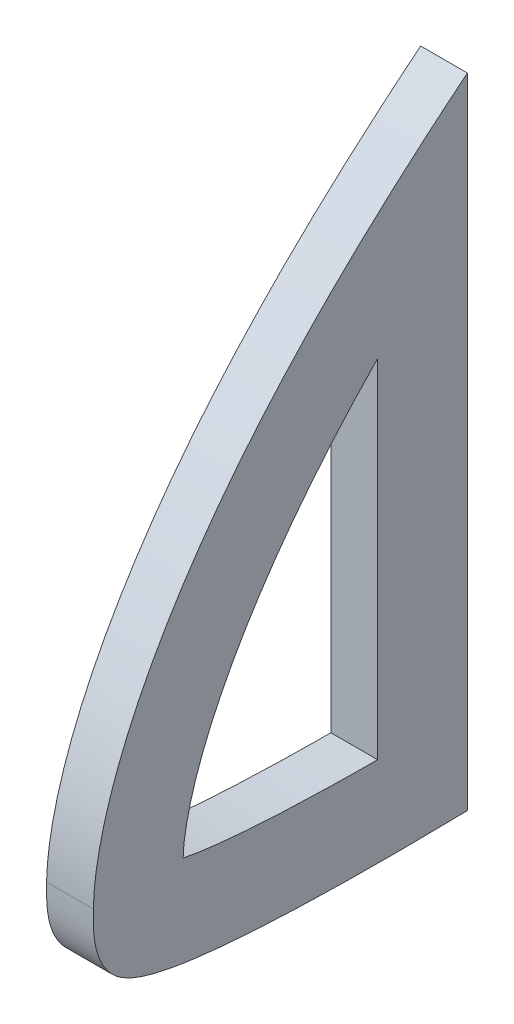
ISO-10303-21;
HEADER;
FILE_DESCRIPTION(('STEP AP214'),'2;1');
FILE_NAME('part.step','',(''),(''),'','','');
FILE_SCHEMA(('AUTOMOTIVE_DESIGN { 1 0 10303 214 1 1 1 1 }'));
ENDSEC;
DATA;
#1=APPLICATION_CONTEXT('core data for automotive mechanical design processes');
#2=APPLICATION_PROTOCOL_DEFINITION('international standard','automotive_design',2000,#1);
#3=PRODUCT_CONTEXT('',#1,'mechanical');
#4=PRODUCT('Part','Part','',(#3));
#5=PRODUCT_RELATED_PRODUCT_CATEGORY('part','',(#4));
#6=PRODUCT_DEFINITION_FORMATION('','',#4);
#7=PRODUCT_DEFINITION_CONTEXT('part definition',#1,'design');
#8=PRODUCT_DEFINITION('design','',#6,#7);
#9=PRODUCT_DEFINITION_SHAPE('','',#8);
#10=(LENGTH_UNIT() NAMED_UNIT(*) SI_UNIT(.MILLI.,.METRE.));
#11=(NAMED_UNIT(*) PLANE_ANGLE_UNIT() SI_UNIT($,.RADIAN.));
#12=(NAMED_UNIT(*) SI_UNIT($,.STERADIAN.) SOLID_ANGLE_UNIT());
#13=UNCERTAINTY_MEASURE_WITH_UNIT(LENGTH_MEASURE(1.E-05),#10,'distance_accuracy_value','');
#14=(GEOMETRIC_REPRESENTATION_CONTEXT(3) GLOBAL_UNCERTAINTY_ASSIGNED_CONTEXT((#13)) GLOBAL_UNIT_ASSIGNED_CONTEXT((#10,
#11,#12)) REPRESENTATION_CONTEXT('',''));
#15=CARTESIAN_POINT('',(0.,0.,0.));
#16=DIRECTION('',(0.,0.,1.));
#17=DIRECTION('',(1.,0.,0.));
#18=AXIS2_PLACEMENT_3D('',#15,#16,#17);
#19=CARTESIAN_POINT('',(371.221000000001,20.4824051352699,-253.857356709377));
#20=DIRECTION('',(1.,0.,0.));
#21=DIRECTION('',(0.,0.,-1.));
#22=AXIS2_PLACEMENT_3D('',#19,#20,#21);
#23=PLANE('',#22);
#24=CARTESIAN_POINT('',(371.221000000001,22.718139720802,-263.890836107763));
#25=CARTESIAN_POINT('',(371.221000000001,21.8504655951082,-263.050304630469));
#26=CARTESIAN_POINT('',(371.221000000001,20.0697103943996,-261.396448649421));
#27=CARTESIAN_POINT('',(371.221000000001,16.4310429088977,-258.33587769775));
#28=CARTESIAN_POINT('',(371.221000000001,12.6147283475523,-255.62483582539));
#29=CARTESIAN_POINT('',(371.221000000001,8.5814996198923,-253.358262068845));
#30=CARTESIAN_POINT('',(371.221000000001,6.04491744596442,-252.204005083383));
#31=CARTESIAN_POINT('',(371.221000000001,4.03477318370743,-251.483919081996));
#32=CARTESIAN_POINT('',(371.221000000001,2.57113008869349,-251.061721363835));
#33=CARTESIAN_POINT('',(371.221000000001,1.3736144865242,-250.819404557786));
#34=CARTESIAN_POINT('',(371.221000000001,0.689035589868411,-250.73266935395));
#35=CARTESIAN_POINT('',(371.221000000001,0.383574583943363,-250.706246717294));
#36=CARTESIAN_POINT('',(371.221000000001,0.225821844896807,-250.694993010713));
#37=CARTESIAN_POINT('',(371.221000000001,0.0440405296485963,-250.687248630148));
#38=CARTESIAN_POINT('',(371.221000000001,-0.0631162594830014,-250.683874906053));
#39=B_SPLINE_CURVE_WITH_KNOTS('',3,(#24,#25,#26,#27,#28,#29,#30,#31,#32,#33,#34,#35,#36,#37,
#38),.UNSPECIFIED.,.F.,.F.,(4,1,1,1,1,1,1,1,1,1,1,1,4),(0.694695632137066,0.732690010890311,
0.770684389643556,0.846673147150046,0.884667525903291,0.922661904656536,0.941659094033158,
0.96065628340978,0.979653472786403,0.989152067474714,0.991526716146792,0.99390136481887,
0.998650662163025),.UNSPECIFIED.);
#40=CARTESIAN_POINT('',(371.221000000001,22.718139720802,-263.890836107763));
#41=VERTEX_POINT('',#40);
#42=CARTESIAN_POINT('',(371.221000000001,-0.0631162594830014,-250.683874906053));
#43=VERTEX_POINT('',#42);
#44=EDGE_CURVE('E118',#41,#43,#39,.T.);
#45=ORIENTED_EDGE('',*,*,#44,.T.);
#46=CARTESIAN_POINT('',(371.221000000001,-0.0631162594812344,-250.683874906053));
#47=CARTESIAN_POINT('',(371.221000000001,-0.107913583875508,-250.90217051062));
#48=CARTESIAN_POINT('',(371.221000000001,-0.183658129860586,-251.321325066874));
#49=CARTESIAN_POINT('',(371.221000000001,-0.334300887721626,-252.320804499698));
#50=CARTESIAN_POINT('',(371.221000000001,-0.478658076002535,-253.615733391551));
#51=CARTESIAN_POINT('',(371.221000000001,-0.614347429730466,-255.267766787084));
#52=CARTESIAN_POINT('',(371.221000000001,-0.749494159795089,-257.525783573163));
#53=CARTESIAN_POINT('',(371.221000000001,-0.851435904513919,-260.389967922841));
#54=CARTESIAN_POINT('',(371.221000000001,-0.880298625637806,-262.72764642762));
#55=CARTESIAN_POINT('',(371.221000000001,-0.884518609981148,-263.890836107763));
#56=B_SPLINE_CURVE_WITH_KNOTS('',3,(#46,#47,#48,#49,#50,#51,#52,#53,#54,#55),.UNSPECIFIED.,.F.,
.F.,(4,1,1,1,1,1,1,4),(0.109090977319089,0.120435993836462,0.131781010353834,0.154471043388578,
0.177161076423322,0.199851109458066,0.245231175527554,0.290611241597043),.UNSPECIFIED.);
#57=CARTESIAN_POINT('',(371.221000000001,-0.884518609981148,-263.890836107763));
#58=VERTEX_POINT('',#57);
#59=EDGE_CURVE('E145',#43,#58,#56,.T.);
#60=ORIENTED_EDGE('',*,*,#59,.T.);
#61=DIRECTION('',(0.,1.,0.));
#62=VECTOR('',#61,1.);
#63=CARTESIAN_POINT('',(371.221000000001,20.4824051352699,-263.890836107763));
#64=LINE('',#63,#62);
#65=EDGE_CURVE('E139',#58,#41,#64,.T.);
#66=ORIENTED_EDGE('',*,*,#65,.T.);
#67=EDGE_LOOP('',(#45,#60,#66));
#68=FACE_BOUND('',#67,.T.);
#69=CARTESIAN_POINT('',(371.221000000001,-0.0120258440962718,-244.586836107763));
#70=CARTESIAN_POINT('',(371.221000000001,0.259674267126259,-244.594009462374));
#71=CARTESIAN_POINT('',(371.221000000001,0.530975278473957,-244.604648539472));
#72=CARTESIAN_POINT('',(371.221000000001,1.07139943968305,-244.64483891069));
#73=CARTESIAN_POINT('',(371.221000000001,1.34075150205057,-244.672402363534));
#74=CARTESIAN_POINT('',(371.221000000001,2.14662589824068,-244.774039061691));
#75=CARTESIAN_POINT('',(371.221000000001,2.68207556719507,-244.866447432585));
#76=CARTESIAN_POINT('',(371.221000000001,4.27492552370955,-245.199776645576));
#77=CARTESIAN_POINT('',(371.221000000001,5.31017720991394,-245.494292827036));
#78=CARTESIAN_POINT('',(371.221000000001,7.34375976932394,-246.183491230179));
#79=CARTESIAN_POINT('',(371.221000000001,8.3417625162191,-246.579063657425));
#80=CARTESIAN_POINT('',(371.221000000001,9.8161212061151,-247.233859274155));
#81=CARTESIAN_POINT('',(371.221000000001,10.3037773279066,-247.462425116974));
#82=CARTESIAN_POINT('',(371.221000000001,11.2722301332524,-247.938166435243));
#83=CARTESIAN_POINT('',(371.221000000001,11.7537272178973,-248.185661327081));
#84=CARTESIAN_POINT('',(371.221000000001,14.1308882233892,-249.457853395048));
#85=CARTESIAN_POINT('',(371.221000000001,15.9457768198099,-250.589368336782));
#86=CARTESIAN_POINT('',(371.221000000001,19.4453745257264,-253.02293426992));
#87=CARTESIAN_POINT('',(371.221000000001,21.1289232382604,-254.326505389561));
#88=CARTESIAN_POINT('',(371.221000000001,24.3864050881443,-257.077244808522));
#89=CARTESIAN_POINT('',(371.221000000001,25.9601047662762,-258.524718941071));
#90=CARTESIAN_POINT('',(371.221000000001,28.2545253756608,-260.782559477387));
#91=CARTESIAN_POINT('',(371.221000000001,29.0086275663234,-261.549924040813));
#92=CARTESIAN_POINT('',(371.221000000001,30.490020624409,-263.103592776177));
#93=CARTESIAN_POINT('',(371.221000000001,31.218239485711,-263.890786637643));
#94=CARTESIAN_POINT('',(371.221000000001,33.3696883038736,-266.279938730406));
#95=CARTESIAN_POINT('',(371.221000000001,34.7596285379338,-267.909535514323));
#96=CARTESIAN_POINT('',(371.221000000001,36.2237569044793,-269.709395096047));
#97=CARTESIAN_POINT('',(371.221000000001,36.3360687488581,-269.8480059566));
#98=CARTESIAN_POINT('',(371.221000000001,36.4481164649492,-269.986836107763));
#99=B_SPLINE_CURVE_WITH_KNOTS('',3,(#69,#70,#71,#72,#73,#74,#75,#76,#77,#78,#79,#80,#81,#82,#83,
#84,#85,#86,#87,#88,#89,#90,#91,#92,#93,#94,#95,#96,#97,#98),.UNSPECIFIED.,.F.,.F.,(4,2,2,2,2,2,
2,2,2,2,2,2,2,2,4),(0.557294101190798,0.565106601190798,0.572919101190798,0.588544101190798,
0.619794101190798,0.651044101190798,0.666669101190797,0.682294101190797,0.744794101190797,
0.807294101190797,0.869794101190797,0.901044101190797,0.932294101190796,0.994794101190797,1.),.UNSPECIFIED.);
#100=CARTESIAN_POINT('',(371.221000000001,-0.0120258440962731,-244.586836107763));
#101=VERTEX_POINT('',#100);
#102=CARTESIAN_POINT('',(371.221000000001,36.4481164649492,-269.986836107763));
#103=VERTEX_POINT('',#102);
#104=EDGE_CURVE('E272',#101,#103,#99,.T.);
#105=ORIENTED_EDGE('',*,*,#104,.T.);
#106=DIRECTION('',(0.,-1.,0.));
#107=VECTOR('',#106,1.);
#108=CARTESIAN_POINT('',(371.221000000001,36.4481164649492,-269.986836107763));
#109=LINE('',#108,#107);
#110=CARTESIAN_POINT('',(371.221000000001,-6.92427009507492,-269.986836107763));
#111=VERTEX_POINT('',#110);
#112=EDGE_CURVE('E68',#103,#111,#109,.T.);
#113=ORIENTED_EDGE('',*,*,#112,.T.);
#114=CARTESIAN_POINT('',(371.221000000001,-6.92427009507492,-269.986836107763));
#115=CARTESIAN_POINT('',(371.221000000001,-6.95410745565087,-268.529127270528));
#116=CARTESIAN_POINT('',(371.221000000001,-6.97373122609154,-267.070389237378));
#117=CARTESIAN_POINT('',(371.221000000001,-6.98674641386205,-263.952502384601));
#118=CARTESIAN_POINT('',(371.221000000001,-6.97667791483279,-262.293640437381));
#119=CARTESIAN_POINT('',(371.221000000001,-6.9055600885937,-258.978188087401));
#120=CARTESIAN_POINT('',(371.221000000001,-6.84506028102536,-257.321573199785));
#121=CARTESIAN_POINT('',(371.221000000001,-6.69277953169777,-254.839392496802));
#122=CARTESIAN_POINT('',(371.221000000001,-6.63165144192058,-254.0124608873));
#123=CARTESIAN_POINT('',(371.221000000001,-6.47549450830517,-252.360108178675));
#124=CARTESIAN_POINT('',(371.221000000001,-6.38187618120076,-251.534624231388));
#125=CARTESIAN_POINT('',(371.221000000001,-6.12941544557524,-249.88656251559));
#126=CARTESIAN_POINT('',(371.221000000001,-5.97476222328147,-249.068090486558));
#127=CARTESIAN_POINT('',(371.221000000001,-5.63095959346391,-247.871759563944));
#128=CARTESIAN_POINT('',(371.221000000001,-5.49692827362659,-247.478182969293));
#129=CARTESIAN_POINT('',(371.221000000001,-5.14090791973078,-246.714570853819));
#130=CARTESIAN_POINT('',(371.221000000001,-4.92508748259972,-246.354354619755));
#131=CARTESIAN_POINT('',(371.221000000001,-4.36831180780711,-245.718751167909));
#132=CARTESIAN_POINT('',(371.221000000001,-4.03647030352722,-245.462318214955));
#133=CARTESIAN_POINT('',(371.221000000001,-3.30287505752594,-245.047596562248));
#134=CARTESIAN_POINT('',(371.221000000001,-2.91192468324989,-244.898197927184));
#135=CARTESIAN_POINT('',(371.221000000001,-2.30523356126434,-244.742934440036));
#136=CARTESIAN_POINT('',(371.221000000001,-2.0982737281373,-244.702223652118));
#137=CARTESIAN_POINT('',(371.221000000001,-1.68317762644851,-244.640996446387));
#138=CARTESIAN_POINT('',(371.221000000001,-1.47505021824388,-244.620646397271));
#139=CARTESIAN_POINT('',(371.221000000001,-0.849388852681836,-244.582256757615));
#140=CARTESIAN_POINT('',(371.221000000001,-0.430695604898289,-244.584754473459));
#141=CARTESIAN_POINT('',(371.221000000001,-0.0120258440962731,-244.586836107763));
#142=B_SPLINE_CURVE_WITH_KNOTS('',3,(#114,#115,#116,#117,#118,#119,#120,#121,#122,#123,#124,
#125,#126,#127,#128,#129,#130,#131,#132,#133,#134,#135,#136,#137,#138,#139,#140,#141),
.UNSPECIFIED.,.F.,.F.,(4,2,2,2,2,2,2,2,2,2,2,2,2,4),(0.,0.0549172498909444,0.117417249890945,
0.179917249890945,0.211167249890945,0.242417249890945,0.273667249890943,0.289292249890943,
0.304917249890942,0.320542249890942,0.336167249890942,0.343979749890941,0.351792249890941,
0.367417249890941),.UNSPECIFIED.);
#143=EDGE_CURVE('E12',#111,#101,#142,.T.);
#144=ORIENTED_EDGE('',*,*,#143,.T.);
#145=EDGE_LOOP('',(#105,#113,#144));
#146=FACE_BOUND('',#145,.T.);
#147=ADVANCED_FACE('F58',(#68,#146),#23,.F.);
#148=CARTESIAN_POINT('',(374.396000000001,20.4824051352699,-253.857356709377));
#149=DIRECTION('',(-1.,0.,0.));
#150=DIRECTION('',(0.,0.,1.));
#151=AXIS2_PLACEMENT_3D('',#148,#149,#150);
#152=PLANE('',#151);
#153=DIRECTION('',(0.,1.,0.));
#154=VECTOR('',#153,1.);
#155=CARTESIAN_POINT('',(374.396000000001,-0.884518609981148,-263.890836107763));
#156=LINE('',#155,#154);
#157=CARTESIAN_POINT('',(374.396000000001,-0.884518609981146,-263.890836107763));
#158=VERTEX_POINT('',#157);
#159=CARTESIAN_POINT('',(374.396000000001,22.718139720802,-263.890836107763));
#160=VERTEX_POINT('',#159);
#161=EDGE_CURVE('E124',#158,#160,#156,.T.);
#162=ORIENTED_EDGE('',*,*,#161,.F.);
#163=CARTESIAN_POINT('',(374.396000000001,-0.0631162594812344,-250.683874906053));
#164=CARTESIAN_POINT('',(374.396000000001,-0.107913583875508,-250.90217051062));
#165=CARTESIAN_POINT('',(374.396000000001,-0.183658129860586,-251.321325066874));
#166=CARTESIAN_POINT('',(374.396000000001,-0.334300887721626,-252.320804499698));
#167=CARTESIAN_POINT('',(374.396000000001,-0.478658076002535,-253.615733391551));
#168=CARTESIAN_POINT('',(374.396000000001,-0.614347429730466,-255.267766787084));
#169=CARTESIAN_POINT('',(374.396000000001,-0.749494159795089,-257.525783573163));
#170=CARTESIAN_POINT('',(374.396000000001,-0.851435904513919,-260.389967922841));
#171=CARTESIAN_POINT('',(374.396000000001,-0.880298625637806,-262.72764642762));
#172=CARTESIAN_POINT('',(374.396000000001,-0.884518609981148,-263.890836107763));
#173=B_SPLINE_CURVE_WITH_KNOTS('',3,(#163,#164,#165,#166,#167,#168,#169,#170,#171,#172),
.UNSPECIFIED.,.F.,.F.,(4,1,1,1,1,1,1,4),(0.109090977319089,0.120435993836462,0.131781010353834,
0.154471043388578,0.177161076423322,0.199851109458066,0.245231175527554,0.290611241597043),.UNSPECIFIED.);
#174=CARTESIAN_POINT('',(374.396000000001,-0.0631162594830014,-250.683874906053));
#175=VERTEX_POINT('',#174);
#176=EDGE_CURVE('E84',#175,#158,#173,.T.);
#177=ORIENTED_EDGE('',*,*,#176,.F.);
#178=CARTESIAN_POINT('',(374.396000000001,22.718139720802,-263.890836107763));
#179=CARTESIAN_POINT('',(374.396000000001,21.8504655951082,-263.050304630469));
#180=CARTESIAN_POINT('',(374.396000000001,20.0697103943996,-261.396448649421));
#181=CARTESIAN_POINT('',(374.396000000001,16.4310429088977,-258.33587769775));
#182=CARTESIAN_POINT('',(374.396000000001,12.6147283475523,-255.62483582539));
#183=CARTESIAN_POINT('',(374.396000000001,8.5814996198923,-253.358262068845));
#184=CARTESIAN_POINT('',(374.396000000001,6.04491744596442,-252.204005083383));
#185=CARTESIAN_POINT('',(374.396000000001,4.03477318370743,-251.483919081996));
#186=CARTESIAN_POINT('',(374.396000000001,2.57113008869349,-251.061721363835));
#187=CARTESIAN_POINT('',(374.396000000001,1.3736144865242,-250.819404557786));
#188=CARTESIAN_POINT('',(374.396000000001,0.689035589868411,-250.73266935395));
#189=CARTESIAN_POINT('',(374.396000000001,0.383574583943363,-250.706246717294));
#190=CARTESIAN_POINT('',(374.396000000001,0.225821844896807,-250.694993010713));
#191=CARTESIAN_POINT('',(374.396000000001,0.0440405296485963,-250.687248630148));
#192=CARTESIAN_POINT('',(374.396000000001,-0.0631162594830014,-250.683874906053));
#193=B_SPLINE_CURVE_WITH_KNOTS('',3,(#178,#179,#180,#181,#182,#183,#184,#185,#186,#187,#188,
#189,#190,#191,#192),.UNSPECIFIED.,.F.,.F.,(4,1,1,1,1,1,1,1,1,1,1,1,4),(0.694695632137066,
0.732690010890311,0.770684389643556,0.846673147150046,0.884667525903291,0.922661904656536,
0.941659094033158,0.96065628340978,0.979653472786403,0.989152067474714,0.991526716146792,
0.99390136481887,0.998650662163025),.UNSPECIFIED.);
#194=EDGE_CURVE('E116',#160,#175,#193,.T.);
#195=ORIENTED_EDGE('',*,*,#194,.F.);
#196=EDGE_LOOP('',(#162,#177,#195));
#197=FACE_BOUND('',#196,.T.);
#198=CARTESIAN_POINT('',(374.396000000001,-0.0120258440962718,-244.586836107763));
#199=CARTESIAN_POINT('',(374.396000000001,0.259674267126259,-244.594009462374));
#200=CARTESIAN_POINT('',(374.396000000001,0.530975278473957,-244.604648539472));
#201=CARTESIAN_POINT('',(374.396000000001,1.07139943968305,-244.64483891069));
#202=CARTESIAN_POINT('',(374.396000000001,1.34075150205057,-244.672402363534));
#203=CARTESIAN_POINT('',(374.396000000001,2.14662589824068,-244.774039061691));
#204=CARTESIAN_POINT('',(374.396000000001,2.68207556719507,-244.866447432585));
#205=CARTESIAN_POINT('',(374.396000000001,4.27492552370955,-245.199776645576));
#206=CARTESIAN_POINT('',(374.396000000001,5.31017720991394,-245.494292827036));
#207=CARTESIAN_POINT('',(374.396000000001,7.34375976932394,-246.183491230179));
#208=CARTESIAN_POINT('',(374.396000000001,8.3417625162191,-246.579063657425));
#209=CARTESIAN_POINT('',(374.396000000001,9.8161212061151,-247.233859274155));
#210=CARTESIAN_POINT('',(374.396000000001,10.3037773279066,-247.462425116974));
#211=CARTESIAN_POINT('',(374.396000000001,11.2722301332524,-247.938166435243));
#212=CARTESIAN_POINT('',(374.396000000001,11.7537272178973,-248.185661327081));
#213=CARTESIAN_POINT('',(374.396000000001,14.1308882233892,-249.457853395048));
#214=CARTESIAN_POINT('',(374.396000000001,15.9457768198099,-250.589368336782));
#215=CARTESIAN_POINT('',(374.396000000001,19.4453745257264,-253.02293426992));
#216=CARTESIAN_POINT('',(374.396000000001,21.1289232382604,-254.326505389561));
#217=CARTESIAN_POINT('',(374.396000000001,24.3864050881443,-257.077244808522));
#218=CARTESIAN_POINT('',(374.396000000001,25.9601047662762,-258.524718941071));
#219=CARTESIAN_POINT('',(374.396000000001,28.2545253756608,-260.782559477387));
#220=CARTESIAN_POINT('',(374.396000000001,29.0086275663234,-261.549924040813));
#221=CARTESIAN_POINT('',(374.396000000001,30.490020624409,-263.103592776177));
#222=CARTESIAN_POINT('',(374.396000000001,31.218239485711,-263.890786637643));
#223=CARTESIAN_POINT('',(374.396000000001,33.3696883038736,-266.279938730406));
#224=CARTESIAN_POINT('',(374.396000000001,34.7596285379338,-267.909535514323));
#225=CARTESIAN_POINT('',(374.396000000001,36.2237569044793,-269.709395096047));
#226=CARTESIAN_POINT('',(374.396000000001,36.3360687488581,-269.8480059566));
#227=CARTESIAN_POINT('',(374.396000000001,36.4481164649492,-269.986836107763));
#228=B_SPLINE_CURVE_WITH_KNOTS('',3,(#198,#199,#200,#201,#202,#203,#204,#205,#206,#207,#208,
#209,#210,#211,#212,#213,#214,#215,#216,#217,#218,#219,#220,#221,#222,#223,#224,#225,#226,#227),
.UNSPECIFIED.,.F.,.F.,(4,2,2,2,2,2,2,2,2,2,2,2,2,2,4),(0.557294101190798,0.565106601190798,
0.572919101190798,0.588544101190798,0.619794101190798,0.651044101190798,0.666669101190797,
0.682294101190797,0.744794101190797,0.807294101190797,0.869794101190797,0.901044101190797,
0.932294101190796,0.994794101190797,1.),.UNSPECIFIED.);
#229=CARTESIAN_POINT('',(374.396000000001,-0.0120258440962731,-244.586836107763));
#230=VERTEX_POINT('',#229);
#231=CARTESIAN_POINT('',(374.396000000001,36.4481164649492,-269.986836107763));
#232=VERTEX_POINT('',#231);
#233=EDGE_CURVE('E153',#230,#232,#228,.T.);
#234=ORIENTED_EDGE('',*,*,#233,.F.);
#235=CARTESIAN_POINT('',(374.396000000001,-6.92427009507492,-269.986836107763));
#236=CARTESIAN_POINT('',(374.396000000001,-6.95410745565087,-268.529127270528));
#237=CARTESIAN_POINT('',(374.396000000001,-6.97373122609154,-267.070389237378));
#238=CARTESIAN_POINT('',(374.396000000001,-6.98674641386205,-263.952502384601));
#239=CARTESIAN_POINT('',(374.396000000001,-6.97667791483279,-262.293640437381));
#240=CARTESIAN_POINT('',(374.396000000001,-6.9055600885937,-258.978188087401));
#241=CARTESIAN_POINT('',(374.396000000001,-6.84506028102536,-257.321573199785));
#242=CARTESIAN_POINT('',(374.396000000001,-6.69277953169777,-254.839392496802));
#243=CARTESIAN_POINT('',(374.396000000001,-6.63165144192058,-254.0124608873));
#244=CARTESIAN_POINT('',(374.396000000001,-6.47549450830517,-252.360108178675));
#245=CARTESIAN_POINT('',(374.396000000001,-6.38187618120076,-251.534624231388));
#246=CARTESIAN_POINT('',(374.396000000001,-6.12941544557524,-249.88656251559));
#247=CARTESIAN_POINT('',(374.396000000001,-5.97476222328147,-249.068090486558));
#248=CARTESIAN_POINT('',(374.396000000001,-5.63095959346391,-247.871759563944));
#249=CARTESIAN_POINT('',(374.396000000001,-5.49692827362659,-247.478182969293));
#250=CARTESIAN_POINT('',(374.396000000001,-5.14090791973078,-246.714570853819));
#251=CARTESIAN_POINT('',(374.396000000001,-4.92508748259972,-246.354354619755));
#252=CARTESIAN_POINT('',(374.396000000001,-4.36831180780711,-245.718751167909));
#253=CARTESIAN_POINT('',(374.396000000001,-4.03647030352722,-245.462318214955));
#254=CARTESIAN_POINT('',(374.396000000001,-3.30287505752594,-245.047596562248));
#255=CARTESIAN_POINT('',(374.396000000001,-2.91192468324989,-244.898197927184));
#256=CARTESIAN_POINT('',(374.396000000001,-2.30523356126434,-244.742934440036));
#257=CARTESIAN_POINT('',(374.396000000001,-2.0982737281373,-244.702223652118));
#258=CARTESIAN_POINT('',(374.396000000001,-1.68317762644851,-244.640996446387));
#259=CARTESIAN_POINT('',(374.396000000001,-1.47505021824388,-244.620646397271));
#260=CARTESIAN_POINT('',(374.396000000001,-0.849388852681836,-244.582256757615));
#261=CARTESIAN_POINT('',(374.396000000001,-0.430695604898289,-244.584754473459));
#262=CARTESIAN_POINT('',(374.396000000001,-0.0120258440962731,-244.586836107763));
#263=B_SPLINE_CURVE_WITH_KNOTS('',3,(#235,#236,#237,#238,#239,#240,#241,#242,#243,#244,#245,
#246,#247,#248,#249,#250,#251,#252,#253,#254,#255,#256,#257,#258,#259,#260,#261,#262),
.UNSPECIFIED.,.F.,.F.,(4,2,2,2,2,2,2,2,2,2,2,2,2,4),(0.,0.0549172498909444,0.117417249890945,
0.179917249890945,0.211167249890945,0.242417249890945,0.273667249890943,0.289292249890943,
0.304917249890942,0.320542249890942,0.336167249890942,0.343979749890941,0.351792249890941,
0.367417249890941),.UNSPECIFIED.);
#264=CARTESIAN_POINT('',(374.396000000001,-6.92427009507492,-269.986836107763));
#265=VERTEX_POINT('',#264);
#266=EDGE_CURVE('E205',#265,#230,#263,.T.);
#267=ORIENTED_EDGE('',*,*,#266,.F.);
#268=DIRECTION('',(0.,-1.,0.));
#269=VECTOR('',#268,1.);
#270=CARTESIAN_POINT('',(374.396000000001,36.4481164649492,-269.986836107763));
#271=LINE('',#270,#269);
#272=EDGE_CURVE('E161',#232,#265,#271,.T.);
#273=ORIENTED_EDGE('',*,*,#272,.F.);
#274=EDGE_LOOP('',(#234,#267,#273));
#275=FACE_BOUND('',#274,.T.);
#276=ADVANCED_FACE('F128',(#197,#275),#152,.F.);
#277=CARTESIAN_POINT('',(374.396000000001,-6.92427009507492,-269.986836107763));
#278=CARTESIAN_POINT('',(371.221000000001,-6.92427009507492,-269.986836107763));
#279=CARTESIAN_POINT('',(374.396,-7.01972573338484,-265.32333622566));
#280=CARTESIAN_POINT('',(371.221000000001,-7.01972573338484,-265.32333622566));
#281=CARTESIAN_POINT('',(374.396000000001,-7.04091730073963,-259.519043621175));
#282=CARTESIAN_POINT('',(371.221000000002,-7.04091730073963,-259.519043621175));
#283=CARTESIAN_POINT('',(374.396000000001,-6.54483304068692,-252.794961614027));
#284=CARTESIAN_POINT('',(371.221000000001,-6.54483304068692,-252.794961614027));
#285=CARTESIAN_POINT('',(374.396,-6.2024227063394,-250.143137560666));
#286=CARTESIAN_POINT('',(371.220999999999,-6.2024227063394,-250.143137560666));
#287=CARTESIAN_POINT('',(374.396000000001,-5.70308651401199,-247.92255118915));
#288=CARTESIAN_POINT('',(371.221,-5.70308651401199,-247.92255118915));
#289=CARTESIAN_POINT('',(374.396,-5.17589461024699,-246.66866850189));
#290=CARTESIAN_POINT('',(371.221,-5.17589461024699,-246.66866850189));
#291=CARTESIAN_POINT('',(374.396000000002,-4.08843366796612,-245.366150428707));
#292=CARTESIAN_POINT('',(371.221000000003,-4.08843366796612,-245.366150428707));
#293=CARTESIAN_POINT('',(374.396000000002,-2.47873607067457,-244.591266667895));
#294=CARTESIAN_POINT('',(371.221000000001,-2.47873607067457,-244.591266667895));
#295=CARTESIAN_POINT('',(374.396000000001,-0.758526905428529,-244.58312448977));
#296=CARTESIAN_POINT('',(371.221,-0.758526905428529,-244.58312448977));
#297=CARTESIAN_POINT('',(374.396000000001,-0.0120258440962731,-244.586836107763));
#298=CARTESIAN_POINT('',(371.221000000001,-0.0120258440962731,-244.586836107763));
#299=B_SPLINE_SURFACE_WITH_KNOTS('',3,1,((#277,#278),(#279,#280),(#281,#282),(#283,#284),(#285,
#286),(#287,#288),(#289,#290),(#291,#292),(#293,#294),(#295,#296),(#297,#298)),.UNSPECIFIED.,
.F.,.F.,.F.,(4,1,1,1,1,2,1,4),(2,2),(0.,0.477045030174252,0.592969964250157,0.689416235051378,
0.750293356635598,0.825906326647901,0.923653059718742,1.),(0.,1.),.UNSPECIFIED.);
#300=DIRECTION('',(-1.,0.,0.));
#301=VECTOR('',#300,1.);
#302=CARTESIAN_POINT('',(372.808500000001,-0.0120258440962731,-244.586836107763));
#303=LINE('',#302,#301);
#304=EDGE_CURVE('E280',#230,#101,#303,.T.);
#305=DIRECTION('',(1.,0.,0.));
#306=VECTOR('',#305,1.);
#307=CARTESIAN_POINT('',(372.808500000001,-6.92427009507492,-269.986836107763));
#308=LINE('',#307,#306);
#309=EDGE_CURVE('E204',#111,#265,#308,.T.);
#310=ORIENTED_EDGE('',*,*,#266,.T.);
#311=ORIENTED_EDGE('',*,*,#304,.T.);
#312=ORIENTED_EDGE('',*,*,#143,.F.);
#313=ORIENTED_EDGE('',*,*,#309,.T.);
#314=EDGE_LOOP('',(#310,#311,#312,#313));
#315=FACE_BOUND('',#314,.T.);
#316=ADVANCED_FACE('F225',(#315),#299,.T.);
#317=CARTESIAN_POINT('',(374.396000000001,-0.0120258440962718,-244.586836107763));
#318=CARTESIAN_POINT('',(371.221000000001,-0.0120258440962718,-244.586836107763));
#319=CARTESIAN_POINT('',(374.396000000001,0.999763010489668,-244.613549090001));
#320=CARTESIAN_POINT('',(371.221000000001,0.999763010489668,-244.613549090001));
#321=CARTESIAN_POINT('',(374.396,3.08063096149928,-244.87361065839));
#322=CARTESIAN_POINT('',(371.221000000001,3.08063096149928,-244.87361065839));
#323=CARTESIAN_POINT('',(374.396000000001,7.59562683765306,-246.116202043822));
#324=CARTESIAN_POINT('',(371.221,7.59562683765306,-246.116202043822));
#325=CARTESIAN_POINT('',(374.396000000001,12.9935608257695,-248.659854335356));
#326=CARTESIAN_POINT('',(371.221000000002,12.9935608257695,-248.659854335356));
#327=CARTESIAN_POINT('',(374.395999999999,20.2329321055921,-253.393844016826));
#328=CARTESIAN_POINT('',(371.221,20.2329321055921,-253.393844016826));
#329=CARTESIAN_POINT('',(374.396000000001,28.1732191721352,-260.331266305792));
#330=CARTESIAN_POINT('',(371.221000000002,28.1732191721352,-260.331266305792));
#331=CARTESIAN_POINT('',(374.396000000001,33.6426206476132,-266.510750900554));
#332=CARTESIAN_POINT('',(371.221,33.6426206476132,-266.510750900554));
#333=CARTESIAN_POINT('',(374.396000000001,36.4481164649492,-269.986836107763));
#334=CARTESIAN_POINT('',(371.221000000001,36.4481164649492,-269.986836107763));
#335=B_SPLINE_SURFACE_WITH_KNOTS('',3,1,((#317,#318),(#319,#320),(#321,#322),(#323,#324),(#325,
#326),(#327,#328),(#329,#330),(#331,#332),(#333,#334)),.UNSPECIFIED.,.F.,.F.,.F.,(4,1,1,1,1,1,
4),(2,2),(0.,0.0666291250148597,0.137617076800792,0.307646754916916,0.457692741993919,
0.705938499781346,1.),(0.,1.),.UNSPECIFIED.);
#336=DIRECTION('',(-1.,0.,0.));
#337=VECTOR('',#336,1.);
#338=CARTESIAN_POINT('',(372.808500000001,36.4481164649492,-269.986836107763));
#339=LINE('',#338,#337);
#340=EDGE_CURVE('E166',#232,#103,#339,.T.);
#341=ORIENTED_EDGE('',*,*,#233,.T.);
#342=ORIENTED_EDGE('',*,*,#340,.T.);
#343=ORIENTED_EDGE('',*,*,#104,.F.);
#344=ORIENTED_EDGE('',*,*,#304,.F.);
#345=EDGE_LOOP('',(#341,#342,#343,#344));
#346=FACE_BOUND('',#345,.T.);
#347=ADVANCED_FACE('F178',(#346),#335,.T.);
#348=CARTESIAN_POINT('',(0.,-3.4554889131788E-13,-269.986836107763));
#349=DIRECTION('',(0.,0.,1.));
#350=DIRECTION('',(0.,-1.,0.));
#351=AXIS2_PLACEMENT_3D('',#348,#349,#350);
#352=PLANE('',#351);
#353=ORIENTED_EDGE('',*,*,#309,.F.);
#354=ORIENTED_EDGE('',*,*,#112,.F.);
#355=ORIENTED_EDGE('',*,*,#340,.F.);
#356=ORIENTED_EDGE('',*,*,#272,.T.);
#357=EDGE_LOOP('',(#353,#354,#355,#356));
#358=FACE_BOUND('',#357,.T.);
#359=ADVANCED_FACE('F168',(#358),#352,.F.);
#360=CARTESIAN_POINT('',(371.134489895165,-0.0631162594812344,-250.683874906053));
#361=CARTESIAN_POINT('',(371.134489895165,-0.107913583875508,-250.90217051062));
#362=CARTESIAN_POINT('',(371.134489895165,-0.183658129860586,-251.321325066874));
#363=CARTESIAN_POINT('',(371.134489895165,-0.334300887721626,-252.320804499698));
#364=CARTESIAN_POINT('',(371.134489895165,-0.478658076002535,-253.615733391551));
#365=CARTESIAN_POINT('',(371.134489895165,-0.614347429730466,-255.267766787084));
#366=CARTESIAN_POINT('',(371.134489895165,-0.749494159795089,-257.525783573163));
#367=CARTESIAN_POINT('',(371.134489895165,-0.851435904513919,-260.389967922841));
#368=CARTESIAN_POINT('',(371.134489895165,-0.880298625637806,-262.72764642762));
#369=CARTESIAN_POINT('',(371.134489895165,-0.884518609981148,-263.890836107763));
#370=B_SPLINE_CURVE_WITH_KNOTS('',3,(#360,#361,#362,#363,#364,#365,#366,#367,#368,#369),
.UNSPECIFIED.,.F.,.F.,(4,1,1,1,1,1,1,4),(0.109090977319089,0.120435993836462,0.131781010353834,
0.154471043388578,0.177161076423322,0.199851109458066,0.245231175527554,0.290611241597043),.UNSPECIFIED.);
#371=DIRECTION('',(1.,0.,0.));
#372=VECTOR('',#371,1.);
#373=SURFACE_OF_LINEAR_EXTRUSION('',#370,#372);
#374=DIRECTION('',(1.,0.,0.));
#375=VECTOR('',#374,1.);
#376=CARTESIAN_POINT('',(371.134489895165,-0.0631162594830014,-250.683874906053));
#377=LINE('',#376,#375);
#378=EDGE_CURVE('E120',#43,#175,#377,.T.);
#379=ORIENTED_EDGE('',*,*,#378,.T.);
#380=ORIENTED_EDGE('',*,*,#176,.T.);
#381=DIRECTION('',(1.,0.,0.));
#382=VECTOR('',#381,1.);
#383=CARTESIAN_POINT('',(371.134489895165,-0.884518609981148,-263.890836107763));
#384=LINE('',#383,#382);
#385=EDGE_CURVE('E121',#58,#158,#384,.T.);
#386=ORIENTED_EDGE('',*,*,#385,.F.);
#387=ORIENTED_EDGE('',*,*,#59,.F.);
#388=EDGE_LOOP('',(#379,#380,#386,#387));
#389=FACE_BOUND('',#388,.T.);
#390=ADVANCED_FACE('F177',(#389),#373,.F.);
#391=CARTESIAN_POINT('',(371.134489895165,22.718139720802,-263.890836107763));
#392=CARTESIAN_POINT('',(371.134489895165,21.8504655951082,-263.050304630469));
#393=CARTESIAN_POINT('',(371.134489895165,20.0697103943996,-261.396448649421));
#394=CARTESIAN_POINT('',(371.134489895165,16.4310429088977,-258.33587769775));
#395=CARTESIAN_POINT('',(371.134489895165,12.6147283475523,-255.62483582539));
#396=CARTESIAN_POINT('',(371.134489895165,8.5814996198923,-253.358262068845));
#397=CARTESIAN_POINT('',(371.134489895165,6.04491744596442,-252.204005083383));
#398=CARTESIAN_POINT('',(371.134489895165,4.03477318370743,-251.483919081996));
#399=CARTESIAN_POINT('',(371.134489895165,2.57113008869349,-251.061721363835));
#400=CARTESIAN_POINT('',(371.134489895165,1.3736144865242,-250.819404557786));
#401=CARTESIAN_POINT('',(371.134489895165,0.689035589868411,-250.73266935395));
#402=CARTESIAN_POINT('',(371.134489895165,0.383574583943363,-250.706246717294));
#403=CARTESIAN_POINT('',(371.134489895165,0.225821844896807,-250.694993010713));
#404=CARTESIAN_POINT('',(371.134489895165,0.0440405296485963,-250.687248630148));
#405=CARTESIAN_POINT('',(371.134489895165,-0.0631162594830014,-250.683874906053));
#406=B_SPLINE_CURVE_WITH_KNOTS('',3,(#391,#392,#393,#394,#395,#396,#397,#398,#399,#400,#401,
#402,#403,#404,#405),.UNSPECIFIED.,.F.,.F.,(4,1,1,1,1,1,1,1,1,1,1,1,4),(0.694695632137066,
0.732690010890311,0.770684389643556,0.846673147150046,0.884667525903291,0.922661904656536,
0.941659094033158,0.96065628340978,0.979653472786403,0.989152067474714,0.991526716146792,
0.99390136481887,0.998650662163025),.UNSPECIFIED.);
#407=DIRECTION('',(1.,0.,0.));
#408=VECTOR('',#407,1.);
#409=SURFACE_OF_LINEAR_EXTRUSION('',#406,#408);
#410=DIRECTION('',(1.,0.,0.));
#411=VECTOR('',#410,1.);
#412=CARTESIAN_POINT('',(371.134489895165,22.718139720802,-263.890836107763));
#413=LINE('',#412,#411);
#414=EDGE_CURVE('E76',#41,#160,#413,.T.);
#415=ORIENTED_EDGE('',*,*,#414,.T.);
#416=ORIENTED_EDGE('',*,*,#194,.T.);
#417=ORIENTED_EDGE('',*,*,#378,.F.);
#418=ORIENTED_EDGE('',*,*,#44,.F.);
#419=EDGE_LOOP('',(#415,#416,#417,#418));
#420=FACE_BOUND('',#419,.T.);
#421=ADVANCED_FACE('F113',(#420),#409,.F.);
#422=CARTESIAN_POINT('',(371.134489895165,-0.884518609981148,-263.890836107763));
#423=DIRECTION('',(0.,0.,-1.));
#424=DIRECTION('',(-1.,0.,0.));
#425=AXIS2_PLACEMENT_3D('',#422,#423,#424);
#426=PLANE('',#425);
#427=ORIENTED_EDGE('',*,*,#385,.T.);
#428=ORIENTED_EDGE('',*,*,#161,.T.);
#429=ORIENTED_EDGE('',*,*,#414,.F.);
#430=ORIENTED_EDGE('',*,*,#65,.F.);
#431=EDGE_LOOP('',(#427,#428,#429,#430));
#432=FACE_BOUND('',#431,.T.);
#433=ADVANCED_FACE('F125',(#432),#426,.F.);
#434=CLOSED_SHELL('',(#147,#276,#316,#347,#359,#390,#421,#433));
#435=MANIFOLD_SOLID_BREP('B2',#434);
#436=ADVANCED_BREP_SHAPE_REPRESENTATION('',(#18,#435),#14);
#437=SHAPE_DEFINITION_REPRESENTATION(#9,#436);
ENDSEC;
END-ISO-10303-21;
